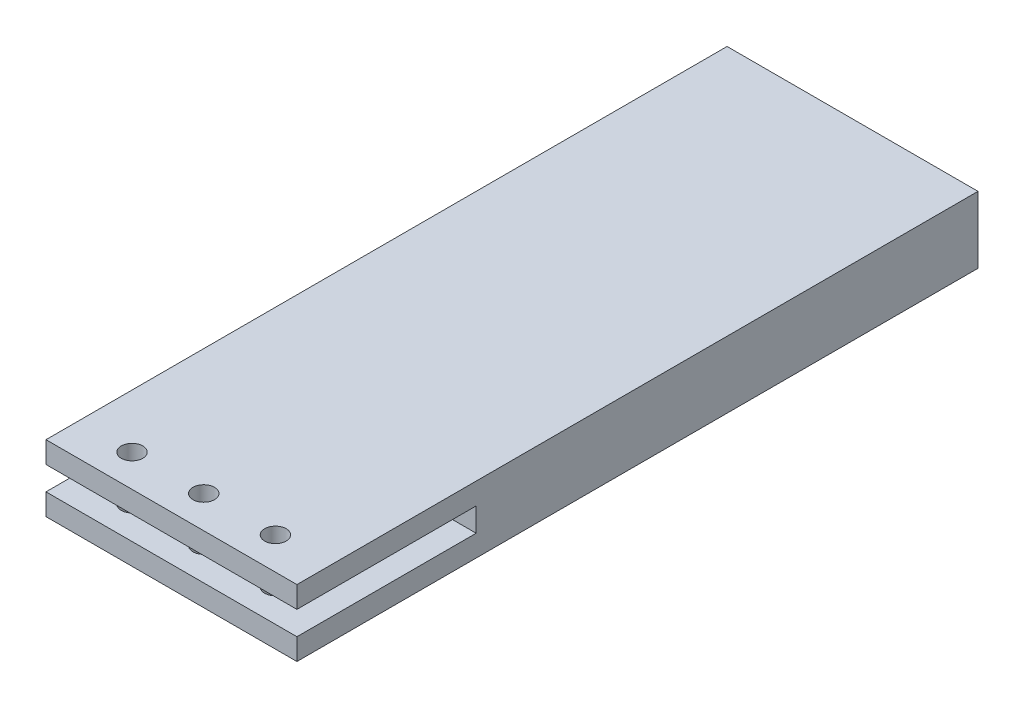
ISO-10303-21;
HEADER;
FILE_DESCRIPTION(('STEP AP214'),'2;1');
FILE_NAME('part.step','',(''),(''),'','','');
FILE_SCHEMA(('AUTOMOTIVE_DESIGN { 1 0 10303 214 1 1 1 1 }'));
ENDSEC;
DATA;
#1=APPLICATION_CONTEXT('core data for automotive mechanical design processes');
#2=APPLICATION_PROTOCOL_DEFINITION('international standard','automotive_design',2000,#1);
#3=PRODUCT_CONTEXT('',#1,'mechanical');
#4=PRODUCT('Part','Part','',(#3));
#5=PRODUCT_RELATED_PRODUCT_CATEGORY('part','',(#4));
#6=PRODUCT_DEFINITION_FORMATION('','',#4);
#7=PRODUCT_DEFINITION_CONTEXT('part definition',#1,'design');
#8=PRODUCT_DEFINITION('design','',#6,#7);
#9=PRODUCT_DEFINITION_SHAPE('','',#8);
#10=(LENGTH_UNIT() NAMED_UNIT(*) SI_UNIT(.MILLI.,.METRE.));
#11=(NAMED_UNIT(*) PLANE_ANGLE_UNIT() SI_UNIT($,.RADIAN.));
#12=(NAMED_UNIT(*) SI_UNIT($,.STERADIAN.) SOLID_ANGLE_UNIT());
#13=UNCERTAINTY_MEASURE_WITH_UNIT(LENGTH_MEASURE(1.E-05),#10,'distance_accuracy_value','');
#14=(GEOMETRIC_REPRESENTATION_CONTEXT(3) GLOBAL_UNCERTAINTY_ASSIGNED_CONTEXT((#13)) GLOBAL_UNIT_ASSIGNED_CONTEXT((#10,
#11,#12)) REPRESENTATION_CONTEXT('',''));
#15=CARTESIAN_POINT('',(0.,0.,0.));
#16=DIRECTION('',(0.,0.,1.));
#17=DIRECTION('',(1.,0.,0.));
#18=AXIS2_PLACEMENT_3D('',#15,#16,#17);
#19=CARTESIAN_POINT('',(0.,0.,0.));
#20=DIRECTION('',(0.,0.,-1.));
#21=DIRECTION('',(-1.,0.,0.));
#22=AXIS2_PLACEMENT_3D('',#19,#20,#21);
#23=PLANE('',#22);
#24=DIRECTION('',(-1.,0.,0.));
#25=VECTOR('',#24,1.);
#26=CARTESIAN_POINT('',(0.,-3.3,0.));
#27=LINE('',#26,#25);
#28=CARTESIAN_POINT('',(35.,-3.3,0.));
#29=VERTEX_POINT('',#28);
#30=CARTESIAN_POINT('',(0.,-3.3,0.));
#31=VERTEX_POINT('',#30);
#32=EDGE_CURVE('E56',#29,#31,#27,.T.);
#33=ORIENTED_EDGE('',*,*,#32,.F.);
#34=DIRECTION('',(0.,-1.,0.));
#35=VECTOR('',#34,1.);
#36=CARTESIAN_POINT('',(35.,3.,0.));
#37=LINE('',#36,#35);
#38=CARTESIAN_POINT('',(35.,0.,0.));
#39=VERTEX_POINT('',#38);
#40=EDGE_CURVE('E74',#39,#29,#37,.T.);
#41=ORIENTED_EDGE('',*,*,#40,.F.);
#42=DIRECTION('',(1.,0.,0.));
#43=VECTOR('',#42,1.);
#44=CARTESIAN_POINT('',(0.,0.,0.));
#45=LINE('',#44,#43);
#46=CARTESIAN_POINT('',(0.,0.,0.));
#47=VERTEX_POINT('',#46);
#48=EDGE_CURVE('E102',#47,#39,#45,.T.);
#49=ORIENTED_EDGE('',*,*,#48,.F.);
#50=DIRECTION('',(0.,1.,0.));
#51=VECTOR('',#50,1.);
#52=CARTESIAN_POINT('',(0.,3.,0.));
#53=LINE('',#52,#51);
#54=EDGE_CURVE('E84',#31,#47,#53,.T.);
#55=ORIENTED_EDGE('',*,*,#54,.F.);
#56=EDGE_LOOP('',(#33,#41,#49,#55));
#57=FACE_BOUND('',#56,.T.);
#58=ADVANCED_FACE('F39',(#57),#23,.F.);
#59=CARTESIAN_POINT('',(0.,0.,25.));
#60=DIRECTION('',(1.,0.,0.));
#61=DIRECTION('',(0.,0.,-1.));
#62=AXIS2_PLACEMENT_3D('',#59,#60,#61);
#63=PLANE('',#62);
#64=DIRECTION('',(0.,0.,-1.));
#65=VECTOR('',#64,1.);
#66=CARTESIAN_POINT('',(0.,3.,25.));
#67=LINE('',#66,#65);
#68=CARTESIAN_POINT('',(0.,3.,25.));
#69=VERTEX_POINT('',#68);
#70=CARTESIAN_POINT('',(0.,3.,-70.));
#71=VERTEX_POINT('',#70);
#72=EDGE_CURVE('E109',#69,#71,#67,.T.);
#73=ORIENTED_EDGE('',*,*,#72,.T.);
#74=DIRECTION('',(0.,1.,0.));
#75=VECTOR('',#74,1.);
#76=CARTESIAN_POINT('',(0.,3.,-70.));
#77=LINE('',#76,#75);
#78=CARTESIAN_POINT('',(0.,-6.3,-70.));
#79=VERTEX_POINT('',#78);
#80=EDGE_CURVE('E171',#79,#71,#77,.T.);
#81=ORIENTED_EDGE('',*,*,#80,.F.);
#82=DIRECTION('',(0.,0.,1.));
#83=VECTOR('',#82,1.);
#84=CARTESIAN_POINT('',(0.,-6.3,-70.));
#85=LINE('',#84,#83);
#86=CARTESIAN_POINT('',(0.,-6.3,25.));
#87=VERTEX_POINT('',#86);
#88=EDGE_CURVE('E177',#79,#87,#85,.T.);
#89=ORIENTED_EDGE('',*,*,#88,.T.);
#90=DIRECTION('',(0.,-1.,0.));
#91=VECTOR('',#90,1.);
#92=CARTESIAN_POINT('',(0.,-3.3,25.));
#93=LINE('',#92,#91);
#94=CARTESIAN_POINT('',(0.,-3.3,25.));
#95=VERTEX_POINT('',#94);
#96=EDGE_CURVE('E154',#95,#87,#93,.T.);
#97=ORIENTED_EDGE('',*,*,#96,.F.);
#98=DIRECTION('',(0.,0.,-1.));
#99=VECTOR('',#98,1.);
#100=CARTESIAN_POINT('',(0.,-3.3,25.));
#101=LINE('',#100,#99);
#102=EDGE_CURVE('E150',#95,#31,#101,.T.);
#103=ORIENTED_EDGE('',*,*,#102,.T.);
#104=ORIENTED_EDGE('',*,*,#54,.T.);
#105=DIRECTION('',(0.,0.,-1.));
#106=VECTOR('',#105,1.);
#107=CARTESIAN_POINT('',(0.,0.,25.));
#108=LINE('',#107,#106);
#109=CARTESIAN_POINT('',(0.,0.,25.));
#110=VERTEX_POINT('',#109);
#111=EDGE_CURVE('E11',#110,#47,#108,.T.);
#112=ORIENTED_EDGE('',*,*,#111,.F.);
#113=DIRECTION('',(0.,-1.,0.));
#114=VECTOR('',#113,1.);
#115=CARTESIAN_POINT('',(0.,0.,25.));
#116=LINE('',#115,#114);
#117=EDGE_CURVE('E97',#69,#110,#116,.T.);
#118=ORIENTED_EDGE('',*,*,#117,.F.);
#119=EDGE_LOOP('',(#73,#81,#89,#97,#103,#104,#112,#118));
#120=FACE_BOUND('',#119,.T.);
#121=ADVANCED_FACE('F41',(#120),#63,.F.);
#122=CARTESIAN_POINT('',(0.,0.,25.));
#123=DIRECTION('',(0.,1.,0.));
#124=DIRECTION('',(0.,0.,1.));
#125=AXIS2_PLACEMENT_3D('',#122,#123,#124);
#126=PLANE('',#125);
#127=CARTESIAN_POINT('',(7.5,0.,20.5));
#128=DIRECTION('',(0.,1.,0.));
#129=DIRECTION('',(0.,0.,1.));
#130=AXIS2_PLACEMENT_3D('',#127,#128,#129);
#131=CIRCLE('',#130,1.5);
#132=CARTESIAN_POINT('',(7.5,0.,22.));
#133=VERTEX_POINT('',#132);
#134=EDGE_CURVE('E144',#133,#133,#131,.T.);
#135=ORIENTED_EDGE('',*,*,#134,.T.);
#136=EDGE_LOOP('',(#135));
#137=FACE_BOUND('',#136,.T.);
#138=CARTESIAN_POINT('',(17.5,0.,20.5));
#139=DIRECTION('',(0.,1.,0.));
#140=DIRECTION('',(0.,0.,1.));
#141=AXIS2_PLACEMENT_3D('',#138,#139,#140);
#142=CIRCLE('',#141,1.5);
#143=CARTESIAN_POINT('',(17.5,0.,22.));
#144=VERTEX_POINT('',#143);
#145=EDGE_CURVE('E129',#144,#144,#142,.T.);
#146=ORIENTED_EDGE('',*,*,#145,.T.);
#147=EDGE_LOOP('',(#146));
#148=FACE_BOUND('',#147,.T.);
#149=CARTESIAN_POINT('',(27.5,0.,20.5));
#150=DIRECTION('',(0.,1.,0.));
#151=DIRECTION('',(0.,0.,1.));
#152=AXIS2_PLACEMENT_3D('',#149,#150,#151);
#153=CIRCLE('',#152,1.5);
#154=CARTESIAN_POINT('',(27.5,0.,22.));
#155=VERTEX_POINT('',#154);
#156=EDGE_CURVE('E125',#155,#155,#153,.T.);
#157=ORIENTED_EDGE('',*,*,#156,.T.);
#158=EDGE_LOOP('',(#157));
#159=FACE_BOUND('',#158,.T.);
#160=ORIENTED_EDGE('',*,*,#48,.T.);
#161=DIRECTION('',(0.,0.,-1.));
#162=VECTOR('',#161,1.);
#163=CARTESIAN_POINT('',(35.,0.,25.));
#164=LINE('',#163,#162);
#165=CARTESIAN_POINT('',(35.,0.,25.));
#166=VERTEX_POINT('',#165);
#167=EDGE_CURVE('E48',#166,#39,#164,.T.);
#168=ORIENTED_EDGE('',*,*,#167,.F.);
#169=DIRECTION('',(1.,0.,0.));
#170=VECTOR('',#169,1.);
#171=CARTESIAN_POINT('',(0.,0.,25.));
#172=LINE('',#171,#170);
#173=EDGE_CURVE('E90',#110,#166,#172,.T.);
#174=ORIENTED_EDGE('',*,*,#173,.F.);
#175=ORIENTED_EDGE('',*,*,#111,.T.);
#176=EDGE_LOOP('',(#160,#168,#174,#175));
#177=FACE_BOUND('',#176,.T.);
#178=ADVANCED_FACE('F101',(#137,#148,#159,#177),#126,.F.);
#179=CARTESIAN_POINT('',(35.,0.,25.));
#180=DIRECTION('',(-1.,0.,0.));
#181=DIRECTION('',(0.,0.,1.));
#182=AXIS2_PLACEMENT_3D('',#179,#180,#181);
#183=PLANE('',#182);
#184=ORIENTED_EDGE('',*,*,#167,.T.);
#185=ORIENTED_EDGE('',*,*,#40,.T.);
#186=DIRECTION('',(0.,0.,-1.));
#187=VECTOR('',#186,1.);
#188=CARTESIAN_POINT('',(35.,-3.3,25.));
#189=LINE('',#188,#187);
#190=CARTESIAN_POINT('',(35.,-3.3,25.));
#191=VERTEX_POINT('',#190);
#192=EDGE_CURVE('E147',#191,#29,#189,.T.);
#193=ORIENTED_EDGE('',*,*,#192,.F.);
#194=DIRECTION('',(0.,1.,0.));
#195=VECTOR('',#194,1.);
#196=CARTESIAN_POINT('',(35.,-3.3,25.));
#197=LINE('',#196,#195);
#198=CARTESIAN_POINT('',(35.,-6.3,25.));
#199=VERTEX_POINT('',#198);
#200=EDGE_CURVE('E157',#199,#191,#197,.T.);
#201=ORIENTED_EDGE('',*,*,#200,.F.);
#202=DIRECTION('',(0.,0.,1.));
#203=VECTOR('',#202,1.);
#204=CARTESIAN_POINT('',(35.,-6.3,-70.));
#205=LINE('',#204,#203);
#206=CARTESIAN_POINT('',(35.,-6.3,-70.));
#207=VERTEX_POINT('',#206);
#208=EDGE_CURVE('E114',#207,#199,#205,.T.);
#209=ORIENTED_EDGE('',*,*,#208,.F.);
#210=DIRECTION('',(0.,-1.,0.));
#211=VECTOR('',#210,1.);
#212=CARTESIAN_POINT('',(35.,3.,-70.));
#213=LINE('',#212,#211);
#214=CARTESIAN_POINT('',(35.,3.,-70.));
#215=VERTEX_POINT('',#214);
#216=EDGE_CURVE('E165',#215,#207,#213,.T.);
#217=ORIENTED_EDGE('',*,*,#216,.F.);
#218=DIRECTION('',(0.,0.,-1.));
#219=VECTOR('',#218,1.);
#220=CARTESIAN_POINT('',(35.,3.,25.));
#221=LINE('',#220,#219);
#222=CARTESIAN_POINT('',(35.,3.,25.));
#223=VERTEX_POINT('',#222);
#224=EDGE_CURVE('E104',#223,#215,#221,.T.);
#225=ORIENTED_EDGE('',*,*,#224,.F.);
#226=DIRECTION('',(0.,1.,0.));
#227=VECTOR('',#226,1.);
#228=CARTESIAN_POINT('',(35.,0.,25.));
#229=LINE('',#228,#227);
#230=EDGE_CURVE('E94',#166,#223,#229,.T.);
#231=ORIENTED_EDGE('',*,*,#230,.F.);
#232=EDGE_LOOP('',(#184,#185,#193,#201,#209,#217,#225,#231));
#233=FACE_BOUND('',#232,.T.);
#234=ADVANCED_FACE('F106',(#233),#183,.F.);
#235=CARTESIAN_POINT('',(0.,3.,25.));
#236=DIRECTION('',(0.,-1.,0.));
#237=DIRECTION('',(0.,0.,-1.));
#238=AXIS2_PLACEMENT_3D('',#235,#236,#237);
#239=PLANE('',#238);
#240=CARTESIAN_POINT('',(7.5,3.,20.5));
#241=DIRECTION('',(0.,1.,0.));
#242=DIRECTION('',(0.,0.,1.));
#243=AXIS2_PLACEMENT_3D('',#240,#241,#242);
#244=CIRCLE('',#243,1.5);
#245=CARTESIAN_POINT('',(7.5,3.,22.));
#246=VERTEX_POINT('',#245);
#247=EDGE_CURVE('E121',#246,#246,#244,.T.);
#248=ORIENTED_EDGE('',*,*,#247,.F.);
#249=EDGE_LOOP('',(#248));
#250=FACE_BOUND('',#249,.T.);
#251=CARTESIAN_POINT('',(17.5,3.,20.5));
#252=DIRECTION('',(0.,1.,0.));
#253=DIRECTION('',(0.,0.,1.));
#254=AXIS2_PLACEMENT_3D('',#251,#252,#253);
#255=CIRCLE('',#254,1.5);
#256=CARTESIAN_POINT('',(17.5,3.,22.));
#257=VERTEX_POINT('',#256);
#258=EDGE_CURVE('E279',#257,#257,#255,.T.);
#259=ORIENTED_EDGE('',*,*,#258,.F.);
#260=EDGE_LOOP('',(#259));
#261=FACE_BOUND('',#260,.T.);
#262=CARTESIAN_POINT('',(27.5,3.,20.5));
#263=DIRECTION('',(0.,1.,0.));
#264=DIRECTION('',(0.,0.,1.));
#265=AXIS2_PLACEMENT_3D('',#262,#263,#264);
#266=CIRCLE('',#265,1.5);
#267=CARTESIAN_POINT('',(27.5,3.,22.));
#268=VERTEX_POINT('',#267);
#269=EDGE_CURVE('E277',#268,#268,#266,.T.);
#270=ORIENTED_EDGE('',*,*,#269,.F.);
#271=EDGE_LOOP('',(#270));
#272=FACE_BOUND('',#271,.T.);
#273=ORIENTED_EDGE('',*,*,#224,.T.);
#274=DIRECTION('',(1.,0.,0.));
#275=VECTOR('',#274,1.);
#276=CARTESIAN_POINT('',(35.,3.,-70.));
#277=LINE('',#276,#275);
#278=EDGE_CURVE('E174',#71,#215,#277,.T.);
#279=ORIENTED_EDGE('',*,*,#278,.F.);
#280=ORIENTED_EDGE('',*,*,#72,.F.);
#281=DIRECTION('',(-1.,0.,0.));
#282=VECTOR('',#281,1.);
#283=CARTESIAN_POINT('',(0.,3.,25.));
#284=LINE('',#283,#282);
#285=EDGE_CURVE('E65',#223,#69,#284,.T.);
#286=ORIENTED_EDGE('',*,*,#285,.F.);
#287=EDGE_LOOP('',(#273,#279,#280,#286));
#288=FACE_BOUND('',#287,.T.);
#289=ADVANCED_FACE('F217',(#250,#261,#272,#288),#239,.F.);
#290=CARTESIAN_POINT('',(0.,0.,25.));
#291=DIRECTION('',(0.,0.,-1.));
#292=DIRECTION('',(-1.,0.,0.));
#293=AXIS2_PLACEMENT_3D('',#290,#291,#292);
#294=PLANE('',#293);
#295=ORIENTED_EDGE('',*,*,#117,.T.);
#296=ORIENTED_EDGE('',*,*,#173,.T.);
#297=ORIENTED_EDGE('',*,*,#230,.T.);
#298=ORIENTED_EDGE('',*,*,#285,.T.);
#299=EDGE_LOOP('',(#295,#296,#297,#298));
#300=FACE_BOUND('',#299,.T.);
#301=ADVANCED_FACE('F92',(#300),#294,.F.);
#302=CARTESIAN_POINT('',(35.,-6.3,-70.));
#303=DIRECTION('',(0.,1.,0.));
#304=DIRECTION('',(0.,0.,1.));
#305=AXIS2_PLACEMENT_3D('',#302,#303,#304);
#306=PLANE('',#305);
#307=CARTESIAN_POINT('',(7.5,-6.3,20.5));
#308=DIRECTION('',(0.,1.,0.));
#309=DIRECTION('',(0.,0.,1.));
#310=AXIS2_PLACEMENT_3D('',#307,#308,#309);
#311=CIRCLE('',#310,1.5);
#312=CARTESIAN_POINT('',(7.5,-6.3,22.));
#313=VERTEX_POINT('',#312);
#314=EDGE_CURVE('E141',#313,#313,#311,.T.);
#315=ORIENTED_EDGE('',*,*,#314,.T.);
#316=EDGE_LOOP('',(#315));
#317=FACE_BOUND('',#316,.T.);
#318=CARTESIAN_POINT('',(17.5,-6.3,20.5));
#319=DIRECTION('',(0.,1.,0.));
#320=DIRECTION('',(0.,0.,1.));
#321=AXIS2_PLACEMENT_3D('',#318,#319,#320);
#322=CIRCLE('',#321,1.5);
#323=CARTESIAN_POINT('',(17.5,-6.3,22.));
#324=VERTEX_POINT('',#323);
#325=EDGE_CURVE('E124',#324,#324,#322,.T.);
#326=ORIENTED_EDGE('',*,*,#325,.T.);
#327=EDGE_LOOP('',(#326));
#328=FACE_BOUND('',#327,.T.);
#329=CARTESIAN_POINT('',(27.5,-6.3,20.5));
#330=DIRECTION('',(0.,1.,0.));
#331=DIRECTION('',(0.,0.,1.));
#332=AXIS2_PLACEMENT_3D('',#329,#330,#331);
#333=CIRCLE('',#332,1.5);
#334=CARTESIAN_POINT('',(27.5,-6.3,22.));
#335=VERTEX_POINT('',#334);
#336=EDGE_CURVE('E120',#335,#335,#333,.T.);
#337=ORIENTED_EDGE('',*,*,#336,.T.);
#338=EDGE_LOOP('',(#337));
#339=FACE_BOUND('',#338,.T.);
#340=ORIENTED_EDGE('',*,*,#208,.T.);
#341=DIRECTION('',(1.,0.,0.));
#342=VECTOR('',#341,1.);
#343=CARTESIAN_POINT('',(0.,-6.3,25.));
#344=LINE('',#343,#342);
#345=EDGE_CURVE('E160',#87,#199,#344,.T.);
#346=ORIENTED_EDGE('',*,*,#345,.F.);
#347=ORIENTED_EDGE('',*,*,#88,.F.);
#348=DIRECTION('',(-1.,0.,0.));
#349=VECTOR('',#348,1.);
#350=CARTESIAN_POINT('',(35.,-6.3,-70.));
#351=LINE('',#350,#349);
#352=EDGE_CURVE('E168',#207,#79,#351,.T.);
#353=ORIENTED_EDGE('',*,*,#352,.F.);
#354=EDGE_LOOP('',(#340,#346,#347,#353));
#355=FACE_BOUND('',#354,.T.);
#356=ADVANCED_FACE('F188',(#317,#328,#339,#355),#306,.F.);
#357=CARTESIAN_POINT('',(0.,0.,-70.));
#358=DIRECTION('',(0.,0.,-1.));
#359=DIRECTION('',(-1.,0.,0.));
#360=AXIS2_PLACEMENT_3D('',#357,#358,#359);
#361=PLANE('',#360);
#362=ORIENTED_EDGE('',*,*,#216,.T.);
#363=ORIENTED_EDGE('',*,*,#352,.T.);
#364=ORIENTED_EDGE('',*,*,#80,.T.);
#365=ORIENTED_EDGE('',*,*,#278,.T.);
#366=EDGE_LOOP('',(#362,#363,#364,#365));
#367=FACE_BOUND('',#366,.T.);
#368=ADVANCED_FACE('F216',(#367),#361,.T.);
#369=CARTESIAN_POINT('',(0.,-3.3,25.));
#370=DIRECTION('',(0.,-1.,0.));
#371=DIRECTION('',(0.,0.,-1.));
#372=AXIS2_PLACEMENT_3D('',#369,#370,#371);
#373=PLANE('',#372);
#374=CARTESIAN_POINT('',(7.5,-3.3,20.5));
#375=DIRECTION('',(0.,-1.,0.));
#376=DIRECTION('',(0.,0.,-1.));
#377=AXIS2_PLACEMENT_3D('',#374,#375,#376);
#378=CIRCLE('',#377,1.5);
#379=CARTESIAN_POINT('',(7.5,-3.3,19.));
#380=VERTEX_POINT('',#379);
#381=EDGE_CURVE('E43',#380,#380,#378,.T.);
#382=ORIENTED_EDGE('',*,*,#381,.T.);
#383=EDGE_LOOP('',(#382));
#384=FACE_BOUND('',#383,.T.);
#385=CARTESIAN_POINT('',(17.5,-3.3,20.5));
#386=DIRECTION('',(0.,-1.,0.));
#387=DIRECTION('',(0.,0.,-1.));
#388=AXIS2_PLACEMENT_3D('',#385,#386,#387);
#389=CIRCLE('',#388,1.5);
#390=CARTESIAN_POINT('',(17.5,-3.3,19.));
#391=VERTEX_POINT('',#390);
#392=EDGE_CURVE('E122',#391,#391,#389,.T.);
#393=ORIENTED_EDGE('',*,*,#392,.T.);
#394=EDGE_LOOP('',(#393));
#395=FACE_BOUND('',#394,.T.);
#396=CARTESIAN_POINT('',(27.5,-3.3,20.5));
#397=DIRECTION('',(0.,-1.,0.));
#398=DIRECTION('',(0.,0.,-1.));
#399=AXIS2_PLACEMENT_3D('',#396,#397,#398);
#400=CIRCLE('',#399,1.5);
#401=CARTESIAN_POINT('',(27.5,-3.3,19.));
#402=VERTEX_POINT('',#401);
#403=EDGE_CURVE('E118',#402,#402,#400,.T.);
#404=ORIENTED_EDGE('',*,*,#403,.T.);
#405=EDGE_LOOP('',(#404));
#406=FACE_BOUND('',#405,.T.);
#407=ORIENTED_EDGE('',*,*,#32,.T.);
#408=ORIENTED_EDGE('',*,*,#102,.F.);
#409=DIRECTION('',(-1.,0.,0.));
#410=VECTOR('',#409,1.);
#411=CARTESIAN_POINT('',(0.,-3.3,25.));
#412=LINE('',#411,#410);
#413=EDGE_CURVE('E152',#191,#95,#412,.T.);
#414=ORIENTED_EDGE('',*,*,#413,.F.);
#415=ORIENTED_EDGE('',*,*,#192,.T.);
#416=EDGE_LOOP('',(#407,#408,#414,#415));
#417=FACE_BOUND('',#416,.T.);
#418=ADVANCED_FACE('F204',(#384,#395,#406,#417),#373,.F.);
#419=CARTESIAN_POINT('',(0.,0.,25.));
#420=DIRECTION('',(0.,0.,1.));
#421=DIRECTION('',(1.,0.,0.));
#422=AXIS2_PLACEMENT_3D('',#419,#420,#421);
#423=PLANE('',#422);
#424=ORIENTED_EDGE('',*,*,#96,.T.);
#425=ORIENTED_EDGE('',*,*,#345,.T.);
#426=ORIENTED_EDGE('',*,*,#200,.T.);
#427=ORIENTED_EDGE('',*,*,#413,.T.);
#428=EDGE_LOOP('',(#424,#425,#426,#427));
#429=FACE_BOUND('',#428,.T.);
#430=ADVANCED_FACE('F196',(#429),#423,.T.);
#431=CARTESIAN_POINT('',(27.5,-7.,20.5));
#432=DIRECTION('',(0.,1.,0.));
#433=DIRECTION('',(0.,0.,1.));
#434=AXIS2_PLACEMENT_3D('',#431,#432,#433);
#435=CYLINDRICAL_SURFACE('',#434,1.5);
#436=ORIENTED_EDGE('',*,*,#403,.F.);
#437=EDGE_LOOP('',(#436));
#438=FACE_BOUND('',#437,.T.);
#439=ORIENTED_EDGE('',*,*,#336,.F.);
#440=EDGE_LOOP('',(#439));
#441=FACE_BOUND('',#440,.T.);
#442=ADVANCED_FACE('F248',(#438,#441),#435,.F.);
#443=CARTESIAN_POINT('',(17.5,-7.,20.5));
#444=DIRECTION('',(0.,1.,0.));
#445=DIRECTION('',(0.,0.,1.));
#446=AXIS2_PLACEMENT_3D('',#443,#444,#445);
#447=CYLINDRICAL_SURFACE('',#446,1.5);
#448=ORIENTED_EDGE('',*,*,#392,.F.);
#449=EDGE_LOOP('',(#448));
#450=FACE_BOUND('',#449,.T.);
#451=ORIENTED_EDGE('',*,*,#325,.F.);
#452=EDGE_LOOP('',(#451));
#453=FACE_BOUND('',#452,.T.);
#454=ADVANCED_FACE('F250',(#450,#453),#447,.F.);
#455=CARTESIAN_POINT('',(7.5,-7.,20.5));
#456=DIRECTION('',(0.,1.,0.));
#457=DIRECTION('',(0.,0.,1.));
#458=AXIS2_PLACEMENT_3D('',#455,#456,#457);
#459=CYLINDRICAL_SURFACE('',#458,1.5);
#460=ORIENTED_EDGE('',*,*,#381,.F.);
#461=EDGE_LOOP('',(#460));
#462=FACE_BOUND('',#461,.T.);
#463=ORIENTED_EDGE('',*,*,#314,.F.);
#464=EDGE_LOOP('',(#463));
#465=FACE_BOUND('',#464,.T.);
#466=ADVANCED_FACE('F258',(#462,#465),#459,.F.);
#467=ORIENTED_EDGE('',*,*,#269,.T.);
#468=EDGE_LOOP('',(#467));
#469=FACE_BOUND('',#468,.T.);
#470=ORIENTED_EDGE('',*,*,#156,.F.);
#471=EDGE_LOOP('',(#470));
#472=FACE_BOUND('',#471,.T.);
#473=ADVANCED_FACE('F253',(#469,#472),#435,.F.);
#474=ORIENTED_EDGE('',*,*,#258,.T.);
#475=EDGE_LOOP('',(#474));
#476=FACE_BOUND('',#475,.T.);
#477=ORIENTED_EDGE('',*,*,#145,.F.);
#478=EDGE_LOOP('',(#477));
#479=FACE_BOUND('',#478,.T.);
#480=ADVANCED_FACE('F261',(#476,#479),#447,.F.);
#481=ORIENTED_EDGE('',*,*,#247,.T.);
#482=EDGE_LOOP('',(#481));
#483=FACE_BOUND('',#482,.T.);
#484=ORIENTED_EDGE('',*,*,#134,.F.);
#485=EDGE_LOOP('',(#484));
#486=FACE_BOUND('',#485,.T.);
#487=ADVANCED_FACE('F270',(#483,#486),#459,.F.);
#488=CLOSED_SHELL('',(#58,#121,#178,#234,#289,#301,#356,#368,#418,#430,#442,#454,#466,#473,#480,#487));
#489=MANIFOLD_SOLID_BREP('B2',#488);
#490=ADVANCED_BREP_SHAPE_REPRESENTATION('',(#18,#489),#14);
#491=SHAPE_DEFINITION_REPRESENTATION(#9,#490);
ENDSEC;
END-ISO-10303-21;
